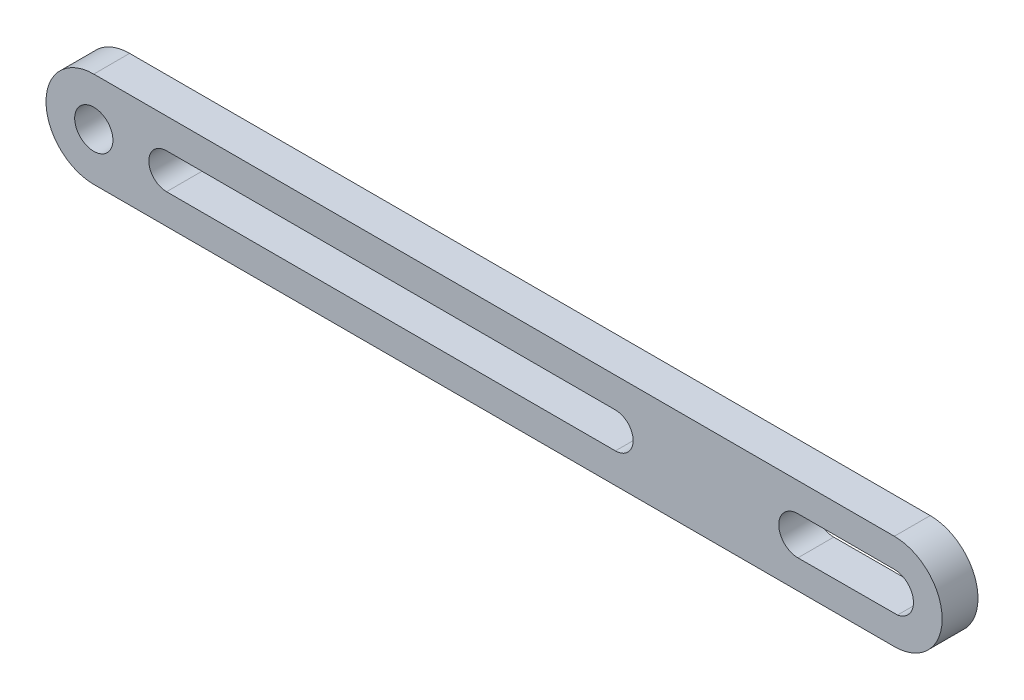
ISO-10303-21;
HEADER;
FILE_DESCRIPTION(('STEP AP214'),'2;1');
FILE_NAME('part.step','',(''),(''),'','','');
FILE_SCHEMA(('AUTOMOTIVE_DESIGN { 1 0 10303 214 1 1 1 1 }'));
ENDSEC;
DATA;
#1=APPLICATION_CONTEXT('core data for automotive mechanical design processes');
#2=APPLICATION_PROTOCOL_DEFINITION('international standard','automotive_design',2000,#1);
#3=PRODUCT_CONTEXT('',#1,'mechanical');
#4=PRODUCT('Part','Part','',(#3));
#5=PRODUCT_RELATED_PRODUCT_CATEGORY('part','',(#4));
#6=PRODUCT_DEFINITION_FORMATION('','',#4);
#7=PRODUCT_DEFINITION_CONTEXT('part definition',#1,'design');
#8=PRODUCT_DEFINITION('design','',#6,#7);
#9=PRODUCT_DEFINITION_SHAPE('','',#8);
#10=(LENGTH_UNIT() NAMED_UNIT(*) SI_UNIT(.MILLI.,.METRE.));
#11=(NAMED_UNIT(*) PLANE_ANGLE_UNIT() SI_UNIT($,.RADIAN.));
#12=(NAMED_UNIT(*) SI_UNIT($,.STERADIAN.) SOLID_ANGLE_UNIT());
#13=UNCERTAINTY_MEASURE_WITH_UNIT(LENGTH_MEASURE(1.E-05),#10,'distance_accuracy_value','');
#14=(GEOMETRIC_REPRESENTATION_CONTEXT(3) GLOBAL_UNCERTAINTY_ASSIGNED_CONTEXT((#13)) GLOBAL_UNIT_ASSIGNED_CONTEXT((#10,
#11,#12)) REPRESENTATION_CONTEXT('',''));
#15=CARTESIAN_POINT('',(0.,0.,0.));
#16=DIRECTION('',(0.,0.,1.));
#17=DIRECTION('',(1.,0.,0.));
#18=AXIS2_PLACEMENT_3D('',#15,#16,#17);
#19=CARTESIAN_POINT('',(-53.8502428277937,0.,3.));
#20=DIRECTION('',(0.,0.,-1.));
#21=DIRECTION('',(-1.,0.,0.));
#22=AXIS2_PLACEMENT_3D('',#19,#20,#21);
#23=CYLINDRICAL_SURFACE('',#22,4.);
#24=CARTESIAN_POINT('',(-53.8502428277937,0.,0.));
#25=DIRECTION('',(0.,0.,1.));
#26=DIRECTION('',(1.,0.,0.));
#27=AXIS2_PLACEMENT_3D('',#24,#25,#26);
#28=CIRCLE('',#27,4.);
#29=CARTESIAN_POINT('',(-53.8502428277937,4.,0.));
#30=VERTEX_POINT('',#29);
#31=CARTESIAN_POINT('',(-53.8502428277937,-4.,0.));
#32=VERTEX_POINT('',#31);
#33=EDGE_CURVE('E208',#30,#32,#28,.T.);
#34=ORIENTED_EDGE('',*,*,#33,.T.);
#35=DIRECTION('',(0.,0.,-1.));
#36=VECTOR('',#35,1.);
#37=CARTESIAN_POINT('',(-53.8502428277937,-4.,3.));
#38=LINE('',#37,#36);
#39=CARTESIAN_POINT('',(-53.8502428277937,-4.,3.));
#40=VERTEX_POINT('',#39);
#41=EDGE_CURVE('E11',#40,#32,#38,.T.);
#42=ORIENTED_EDGE('',*,*,#41,.F.);
#43=CARTESIAN_POINT('',(-53.8502428277937,0.,3.));
#44=DIRECTION('',(0.,0.,1.));
#45=DIRECTION('',(1.,0.,0.));
#46=AXIS2_PLACEMENT_3D('',#43,#44,#45);
#47=CIRCLE('',#46,4.);
#48=CARTESIAN_POINT('',(-53.8502428277937,4.,3.));
#49=VERTEX_POINT('',#48);
#50=EDGE_CURVE('E195',#49,#40,#47,.T.);
#51=ORIENTED_EDGE('',*,*,#50,.F.);
#52=DIRECTION('',(0.,0.,-1.));
#53=VECTOR('',#52,1.);
#54=CARTESIAN_POINT('',(-53.8502428277937,4.,3.));
#55=LINE('',#54,#53);
#56=EDGE_CURVE('E207',#49,#30,#55,.T.);
#57=ORIENTED_EDGE('',*,*,#56,.T.);
#58=EDGE_LOOP('',(#34,#42,#51,#57));
#59=FACE_BOUND('',#58,.T.);
#60=ADVANCED_FACE('F35',(#59),#23,.T.);
#61=CARTESIAN_POINT('',(-53.8502428277937,-4.,3.));
#62=DIRECTION('',(0.,1.,0.));
#63=DIRECTION('',(-1.,0.,0.));
#64=AXIS2_PLACEMENT_3D('',#61,#62,#63);
#65=PLANE('',#64);
#66=DIRECTION('',(1.,0.,0.));
#67=VECTOR('',#66,1.);
#68=CARTESIAN_POINT('',(-53.8502428277937,-4.,0.));
#69=LINE('',#68,#67);
#70=CARTESIAN_POINT('',(13.1497571722063,-4.,0.));
#71=VERTEX_POINT('',#70);
#72=EDGE_CURVE('E211',#32,#71,#69,.T.);
#73=ORIENTED_EDGE('',*,*,#72,.T.);
#74=DIRECTION('',(0.,0.,-1.));
#75=VECTOR('',#74,1.);
#76=CARTESIAN_POINT('',(13.1497571722063,-4.,3.));
#77=LINE('',#76,#75);
#78=CARTESIAN_POINT('',(13.1497571722063,-4.,3.));
#79=VERTEX_POINT('',#78);
#80=EDGE_CURVE('E42',#79,#71,#77,.T.);
#81=ORIENTED_EDGE('',*,*,#80,.F.);
#82=DIRECTION('',(1.,0.,0.));
#83=VECTOR('',#82,1.);
#84=CARTESIAN_POINT('',(-53.8502428277937,-4.,3.));
#85=LINE('',#84,#83);
#86=EDGE_CURVE('E198',#40,#79,#85,.T.);
#87=ORIENTED_EDGE('',*,*,#86,.F.);
#88=ORIENTED_EDGE('',*,*,#41,.T.);
#89=EDGE_LOOP('',(#73,#81,#87,#88));
#90=FACE_BOUND('',#89,.T.);
#91=ADVANCED_FACE('F228',(#90),#65,.F.);
#92=CARTESIAN_POINT('',(13.1497571722063,0.,3.));
#93=DIRECTION('',(0.,0.,-1.));
#94=DIRECTION('',(-1.,0.,0.));
#95=AXIS2_PLACEMENT_3D('',#92,#93,#94);
#96=CYLINDRICAL_SURFACE('',#95,4.);
#97=CARTESIAN_POINT('',(13.1497571722063,0.,0.));
#98=DIRECTION('',(0.,0.,-1.));
#99=DIRECTION('',(-1.,0.,0.));
#100=AXIS2_PLACEMENT_3D('',#97,#98,#99);
#101=CIRCLE('',#100,4.);
#102=CARTESIAN_POINT('',(13.1497571722063,4.,0.));
#103=VERTEX_POINT('',#102);
#104=EDGE_CURVE('E215',#103,#71,#101,.T.);
#105=ORIENTED_EDGE('',*,*,#104,.F.);
#106=DIRECTION('',(0.,0.,-1.));
#107=VECTOR('',#106,1.);
#108=CARTESIAN_POINT('',(13.1497571722063,4.,3.));
#109=LINE('',#108,#107);
#110=CARTESIAN_POINT('',(13.1497571722063,4.,3.));
#111=VERTEX_POINT('',#110);
#112=EDGE_CURVE('E221',#111,#103,#109,.T.);
#113=ORIENTED_EDGE('',*,*,#112,.F.);
#114=CARTESIAN_POINT('',(13.1497571722063,0.,3.));
#115=DIRECTION('',(0.,0.,-1.));
#116=DIRECTION('',(-1.,0.,0.));
#117=AXIS2_PLACEMENT_3D('',#114,#115,#116);
#118=CIRCLE('',#117,4.);
#119=EDGE_CURVE('E201',#111,#79,#118,.T.);
#120=ORIENTED_EDGE('',*,*,#119,.T.);
#121=ORIENTED_EDGE('',*,*,#80,.T.);
#122=EDGE_LOOP('',(#105,#113,#120,#121));
#123=FACE_BOUND('',#122,.T.);
#124=ADVANCED_FACE('F225',(#123),#96,.T.);
#125=CARTESIAN_POINT('',(-53.8502428277937,4.,3.));
#126=DIRECTION('',(0.,1.,0.));
#127=DIRECTION('',(-1.,0.,0.));
#128=AXIS2_PLACEMENT_3D('',#125,#126,#127);
#129=PLANE('',#128);
#130=DIRECTION('',(1.,0.,0.));
#131=VECTOR('',#130,1.);
#132=CARTESIAN_POINT('',(-53.8502428277937,4.,0.));
#133=LINE('',#132,#131);
#134=EDGE_CURVE('E199',#30,#103,#133,.T.);
#135=ORIENTED_EDGE('',*,*,#134,.F.);
#136=ORIENTED_EDGE('',*,*,#56,.F.);
#137=DIRECTION('',(1.,0.,0.));
#138=VECTOR('',#137,1.);
#139=CARTESIAN_POINT('',(-53.8502428277937,4.,3.));
#140=LINE('',#139,#138);
#141=EDGE_CURVE('E204',#49,#111,#140,.T.);
#142=ORIENTED_EDGE('',*,*,#141,.T.);
#143=ORIENTED_EDGE('',*,*,#112,.T.);
#144=EDGE_LOOP('',(#135,#136,#142,#143));
#145=FACE_BOUND('',#144,.T.);
#146=ADVANCED_FACE('F234',(#145),#129,.T.);
#147=CARTESIAN_POINT('',(-53.8502428277937,0.,3.));
#148=DIRECTION('',(0.,0.,1.));
#149=DIRECTION('',(1.,0.,0.));
#150=AXIS2_PLACEMENT_3D('',#147,#148,#149);
#151=PLANE('',#150);
#152=CARTESIAN_POINT('',(-53.8502428277937,0.,3.));
#153=DIRECTION('',(0.,0.,1.));
#154=DIRECTION('',(1.,0.,0.));
#155=AXIS2_PLACEMENT_3D('',#152,#153,#154);
#156=CIRCLE('',#155,1.6);
#157=CARTESIAN_POINT('',(-52.2502428277937,0.,3.));
#158=VERTEX_POINT('',#157);
#159=EDGE_CURVE('E150',#158,#158,#156,.T.);
#160=ORIENTED_EDGE('',*,*,#159,.F.);
#161=EDGE_LOOP('',(#160));
#162=FACE_BOUND('',#161,.T.);
#163=CARTESIAN_POINT('',(-47.7619263249509,0.,3.));
#164=DIRECTION('',(0.,0.,1.));
#165=DIRECTION('',(1.,0.,0.));
#166=AXIS2_PLACEMENT_3D('',#163,#164,#165);
#167=CIRCLE('',#166,1.48347158184053);
#168=CARTESIAN_POINT('',(-47.7619263249509,1.48347158184053,3.));
#169=VERTEX_POINT('',#168);
#170=CARTESIAN_POINT('',(-47.7619263249509,-1.48347158184053,3.));
#171=VERTEX_POINT('',#170);
#172=EDGE_CURVE('E49',#169,#171,#167,.T.);
#173=ORIENTED_EDGE('',*,*,#172,.F.);
#174=DIRECTION('',(-1.,0.,0.));
#175=VECTOR('',#174,1.);
#176=CARTESIAN_POINT('',(-47.7619263249509,1.48347158184053,3.));
#177=LINE('',#176,#175);
#178=CARTESIAN_POINT('',(-10.1945582776389,1.48347158184053,3.));
#179=VERTEX_POINT('',#178);
#180=EDGE_CURVE('E144',#179,#169,#177,.T.);
#181=ORIENTED_EDGE('',*,*,#180,.F.);
#182=CARTESIAN_POINT('',(-10.1945582776389,0.,3.));
#183=DIRECTION('',(0.,0.,1.));
#184=DIRECTION('',(-1.,0.,0.));
#185=AXIS2_PLACEMENT_3D('',#182,#183,#184);
#186=CIRCLE('',#185,1.48347158184053);
#187=CARTESIAN_POINT('',(-10.1945582776389,-1.48347158184053,3.));
#188=VERTEX_POINT('',#187);
#189=EDGE_CURVE('E147',#188,#179,#186,.T.);
#190=ORIENTED_EDGE('',*,*,#189,.F.);
#191=DIRECTION('',(1.,0.,0.));
#192=VECTOR('',#191,1.);
#193=CARTESIAN_POINT('',(-47.7619263249509,-1.48347158184053,3.));
#194=LINE('',#193,#192);
#195=EDGE_CURVE('E156',#171,#188,#194,.T.);
#196=ORIENTED_EDGE('',*,*,#195,.F.);
#197=EDGE_LOOP('',(#173,#181,#190,#196));
#198=FACE_BOUND('',#197,.T.);
#199=CARTESIAN_POINT('',(5.076512496842,0.,3.));
#200=DIRECTION('',(0.,0.,1.));
#201=DIRECTION('',(1.,0.,0.));
#202=AXIS2_PLACEMENT_3D('',#199,#200,#201);
#203=CIRCLE('',#202,1.6);
#204=CARTESIAN_POINT('',(5.076512496842,1.6,3.));
#205=VERTEX_POINT('',#204);
#206=CARTESIAN_POINT('',(5.076512496842,-1.6,3.));
#207=VERTEX_POINT('',#206);
#208=EDGE_CURVE('E57',#205,#207,#203,.T.);
#209=ORIENTED_EDGE('',*,*,#208,.F.);
#210=DIRECTION('',(-1.,0.,0.));
#211=VECTOR('',#210,1.);
#212=CARTESIAN_POINT('',(5.076512496842,1.6,3.));
#213=LINE('',#212,#211);
#214=CARTESIAN_POINT('',(13.1497571722063,1.60000000000001,3.));
#215=VERTEX_POINT('',#214);
#216=EDGE_CURVE('E170',#215,#205,#213,.T.);
#217=ORIENTED_EDGE('',*,*,#216,.F.);
#218=CARTESIAN_POINT('',(13.1497571722063,0.,3.));
#219=DIRECTION('',(0.,0.,1.));
#220=DIRECTION('',(-1.,0.,0.));
#221=AXIS2_PLACEMENT_3D('',#218,#219,#220);
#222=CIRCLE('',#221,1.6);
#223=CARTESIAN_POINT('',(13.4123699058144,-1.57830116015507,3.));
#224=VERTEX_POINT('',#223);
#225=EDGE_CURVE('E184',#224,#215,#222,.T.);
#226=ORIENTED_EDGE('',*,*,#225,.F.);
#227=DIRECTION('',(0.999996612024416,0.00260306352006838,0.));
#228=VECTOR('',#227,1.);
#229=CARTESIAN_POINT('',(5.076512496842,-1.6,3.));
#230=LINE('',#229,#228);
#231=EDGE_CURVE('E181',#207,#224,#230,.T.);
#232=ORIENTED_EDGE('',*,*,#231,.F.);
#233=EDGE_LOOP('',(#209,#217,#226,#232));
#234=FACE_BOUND('',#233,.T.);
#235=ORIENTED_EDGE('',*,*,#50,.T.);
#236=ORIENTED_EDGE('',*,*,#86,.T.);
#237=ORIENTED_EDGE('',*,*,#119,.F.);
#238=ORIENTED_EDGE('',*,*,#141,.F.);
#239=EDGE_LOOP('',(#235,#236,#237,#238));
#240=FACE_BOUND('',#239,.T.);
#241=ADVANCED_FACE('F238',(#162,#198,#234,#240),#151,.T.);
#242=CARTESIAN_POINT('',(-53.8502428277937,0.,0.));
#243=DIRECTION('',(0.,0.,1.));
#244=DIRECTION('',(1.,0.,0.));
#245=AXIS2_PLACEMENT_3D('',#242,#243,#244);
#246=PLANE('',#245);
#247=CARTESIAN_POINT('',(-53.8502428277937,0.,0.));
#248=DIRECTION('',(0.,0.,1.));
#249=DIRECTION('',(1.,0.,0.));
#250=AXIS2_PLACEMENT_3D('',#247,#248,#249);
#251=CIRCLE('',#250,1.6);
#252=CARTESIAN_POINT('',(-52.2502428277937,0.,0.));
#253=VERTEX_POINT('',#252);
#254=EDGE_CURVE('E212',#253,#253,#251,.T.);
#255=ORIENTED_EDGE('',*,*,#254,.T.);
#256=EDGE_LOOP('',(#255));
#257=FACE_BOUND('',#256,.T.);
#258=DIRECTION('',(-1.,0.,0.));
#259=VECTOR('',#258,1.);
#260=CARTESIAN_POINT('',(-47.7619263249509,1.48347158184053,0.));
#261=LINE('',#260,#259);
#262=CARTESIAN_POINT('',(-10.1945582776389,1.48347158184053,0.));
#263=VERTEX_POINT('',#262);
#264=CARTESIAN_POINT('',(-47.7619263249509,1.48347158184053,0.));
#265=VERTEX_POINT('',#264);
#266=EDGE_CURVE('E131',#263,#265,#261,.T.);
#267=ORIENTED_EDGE('',*,*,#266,.T.);
#268=CARTESIAN_POINT('',(-47.7619263249509,0.,0.));
#269=DIRECTION('',(0.,0.,1.));
#270=DIRECTION('',(1.,0.,0.));
#271=AXIS2_PLACEMENT_3D('',#268,#269,#270);
#272=CIRCLE('',#271,1.48347158184053);
#273=CARTESIAN_POINT('',(-47.7619263249509,-1.48347158184053,0.));
#274=VERTEX_POINT('',#273);
#275=EDGE_CURVE('E125',#265,#274,#272,.T.);
#276=ORIENTED_EDGE('',*,*,#275,.T.);
#277=DIRECTION('',(1.,0.,0.));
#278=VECTOR('',#277,1.);
#279=CARTESIAN_POINT('',(-47.7619263249509,-1.48347158184053,0.));
#280=LINE('',#279,#278);
#281=CARTESIAN_POINT('',(-10.1945582776389,-1.48347158184053,0.));
#282=VERTEX_POINT('',#281);
#283=EDGE_CURVE('E135',#274,#282,#280,.T.);
#284=ORIENTED_EDGE('',*,*,#283,.T.);
#285=CARTESIAN_POINT('',(-10.1945582776389,0.,0.));
#286=DIRECTION('',(0.,0.,1.));
#287=DIRECTION('',(-1.,0.,0.));
#288=AXIS2_PLACEMENT_3D('',#285,#286,#287);
#289=CIRCLE('',#288,1.48347158184053);
#290=EDGE_CURVE('E139',#282,#263,#289,.T.);
#291=ORIENTED_EDGE('',*,*,#290,.T.);
#292=EDGE_LOOP('',(#267,#276,#284,#291));
#293=FACE_BOUND('',#292,.T.);
#294=DIRECTION('',(-1.,0.,0.));
#295=VECTOR('',#294,1.);
#296=CARTESIAN_POINT('',(5.076512496842,1.6,0.));
#297=LINE('',#296,#295);
#298=CARTESIAN_POINT('',(13.1497571722063,1.60000000000001,0.));
#299=VERTEX_POINT('',#298);
#300=CARTESIAN_POINT('',(5.076512496842,1.6,0.));
#301=VERTEX_POINT('',#300);
#302=EDGE_CURVE('E176',#299,#301,#297,.T.);
#303=ORIENTED_EDGE('',*,*,#302,.T.);
#304=CARTESIAN_POINT('',(5.076512496842,0.,0.));
#305=DIRECTION('',(0.,0.,1.));
#306=DIRECTION('',(1.,0.,0.));
#307=AXIS2_PLACEMENT_3D('',#304,#305,#306);
#308=CIRCLE('',#307,1.6);
#309=CARTESIAN_POINT('',(5.076512496842,-1.6,0.));
#310=VERTEX_POINT('',#309);
#311=EDGE_CURVE('E166',#301,#310,#308,.T.);
#312=ORIENTED_EDGE('',*,*,#311,.T.);
#313=DIRECTION('',(0.999996612024416,0.00260306352006838,0.));
#314=VECTOR('',#313,1.);
#315=CARTESIAN_POINT('',(5.076512496842,-1.6,0.));
#316=LINE('',#315,#314);
#317=CARTESIAN_POINT('',(13.4123699058144,-1.57830116015507,0.));
#318=VERTEX_POINT('',#317);
#319=EDGE_CURVE('E169',#310,#318,#316,.T.);
#320=ORIENTED_EDGE('',*,*,#319,.T.);
#321=CARTESIAN_POINT('',(13.1497571722063,0.,0.));
#322=DIRECTION('',(0.,0.,1.));
#323=DIRECTION('',(-1.,0.,0.));
#324=AXIS2_PLACEMENT_3D('',#321,#322,#323);
#325=CIRCLE('',#324,1.6);
#326=EDGE_CURVE('E173',#318,#299,#325,.T.);
#327=ORIENTED_EDGE('',*,*,#326,.T.);
#328=EDGE_LOOP('',(#303,#312,#320,#327));
#329=FACE_BOUND('',#328,.T.);
#330=ORIENTED_EDGE('',*,*,#33,.F.);
#331=ORIENTED_EDGE('',*,*,#134,.T.);
#332=ORIENTED_EDGE('',*,*,#104,.T.);
#333=ORIENTED_EDGE('',*,*,#72,.F.);
#334=EDGE_LOOP('',(#330,#331,#332,#333));
#335=FACE_BOUND('',#334,.T.);
#336=ADVANCED_FACE('F141',(#257,#293,#329,#335),#246,.F.);
#337=CARTESIAN_POINT('',(5.076512496842,0.,0.));
#338=DIRECTION('',(0.,0.,1.));
#339=DIRECTION('',(1.,0.,0.));
#340=AXIS2_PLACEMENT_3D('',#337,#338,#339);
#341=CYLINDRICAL_SURFACE('',#340,1.6);
#342=ORIENTED_EDGE('',*,*,#208,.T.);
#343=DIRECTION('',(0.,0.,1.));
#344=VECTOR('',#343,1.);
#345=CARTESIAN_POINT('',(5.076512496842,-1.6,0.));
#346=LINE('',#345,#344);
#347=EDGE_CURVE('E179',#310,#207,#346,.T.);
#348=ORIENTED_EDGE('',*,*,#347,.F.);
#349=ORIENTED_EDGE('',*,*,#311,.F.);
#350=DIRECTION('',(0.,0.,1.));
#351=VECTOR('',#350,1.);
#352=CARTESIAN_POINT('',(5.076512496842,1.6,0.));
#353=LINE('',#352,#351);
#354=EDGE_CURVE('E157',#301,#205,#353,.T.);
#355=ORIENTED_EDGE('',*,*,#354,.T.);
#356=EDGE_LOOP('',(#342,#348,#349,#355));
#357=FACE_BOUND('',#356,.T.);
#358=ADVANCED_FACE('F253',(#357),#341,.F.);
#359=CARTESIAN_POINT('',(5.076512496842,1.6,0.));
#360=DIRECTION('',(0.,1.,0.));
#361=DIRECTION('',(-1.,0.,0.));
#362=AXIS2_PLACEMENT_3D('',#359,#360,#361);
#363=PLANE('',#362);
#364=ORIENTED_EDGE('',*,*,#216,.T.);
#365=ORIENTED_EDGE('',*,*,#354,.F.);
#366=ORIENTED_EDGE('',*,*,#302,.F.);
#367=DIRECTION('',(0.,0.,1.));
#368=VECTOR('',#367,1.);
#369=CARTESIAN_POINT('',(13.1497571722063,1.60000000000001,0.));
#370=LINE('',#369,#368);
#371=EDGE_CURVE('E190',#299,#215,#370,.T.);
#372=ORIENTED_EDGE('',*,*,#371,.T.);
#373=EDGE_LOOP('',(#364,#365,#366,#372));
#374=FACE_BOUND('',#373,.T.);
#375=ADVANCED_FACE('F260',(#374),#363,.F.);
#376=CARTESIAN_POINT('',(13.1497571722063,0.,0.));
#377=DIRECTION('',(0.,0.,1.));
#378=DIRECTION('',(1.,0.,0.));
#379=AXIS2_PLACEMENT_3D('',#376,#377,#378);
#380=CYLINDRICAL_SURFACE('',#379,1.6);
#381=ORIENTED_EDGE('',*,*,#225,.T.);
#382=ORIENTED_EDGE('',*,*,#371,.F.);
#383=ORIENTED_EDGE('',*,*,#326,.F.);
#384=DIRECTION('',(0.,0.,1.));
#385=VECTOR('',#384,1.);
#386=CARTESIAN_POINT('',(13.4123699058144,-1.57830116015507,0.));
#387=LINE('',#386,#385);
#388=EDGE_CURVE('E192',#318,#224,#387,.T.);
#389=ORIENTED_EDGE('',*,*,#388,.T.);
#390=EDGE_LOOP('',(#381,#382,#383,#389));
#391=FACE_BOUND('',#390,.T.);
#392=ADVANCED_FACE('F264',(#391),#380,.F.);
#393=CARTESIAN_POINT('',(5.076512496842,-1.6,0.));
#394=DIRECTION('',(0.00260306352006838,-0.999996612024416,0.));
#395=DIRECTION('',(0.999996612024416,0.00260306352006838,0.));
#396=AXIS2_PLACEMENT_3D('',#393,#394,#395);
#397=PLANE('',#396);
#398=ORIENTED_EDGE('',*,*,#231,.T.);
#399=ORIENTED_EDGE('',*,*,#388,.F.);
#400=ORIENTED_EDGE('',*,*,#319,.F.);
#401=ORIENTED_EDGE('',*,*,#347,.T.);
#402=EDGE_LOOP('',(#398,#399,#400,#401));
#403=FACE_BOUND('',#402,.T.);
#404=ADVANCED_FACE('F261',(#403),#397,.F.);
#405=CARTESIAN_POINT('',(-47.7619263249509,0.,0.));
#406=DIRECTION('',(0.,0.,1.));
#407=DIRECTION('',(1.,0.,0.));
#408=AXIS2_PLACEMENT_3D('',#405,#406,#407);
#409=CYLINDRICAL_SURFACE('',#408,1.48347158184053);
#410=ORIENTED_EDGE('',*,*,#172,.T.);
#411=DIRECTION('',(0.,0.,1.));
#412=VECTOR('',#411,1.);
#413=CARTESIAN_POINT('',(-47.7619263249509,-1.48347158184053,0.));
#414=LINE('',#413,#412);
#415=EDGE_CURVE('E121',#274,#171,#414,.T.);
#416=ORIENTED_EDGE('',*,*,#415,.F.);
#417=ORIENTED_EDGE('',*,*,#275,.F.);
#418=DIRECTION('',(0.,0.,1.));
#419=VECTOR('',#418,1.);
#420=CARTESIAN_POINT('',(-47.7619263249509,1.48347158184053,0.));
#421=LINE('',#420,#419);
#422=EDGE_CURVE('E161',#265,#169,#421,.T.);
#423=ORIENTED_EDGE('',*,*,#422,.T.);
#424=EDGE_LOOP('',(#410,#416,#417,#423));
#425=FACE_BOUND('',#424,.T.);
#426=ADVANCED_FACE('F123',(#425),#409,.F.);
#427=CARTESIAN_POINT('',(-47.7619263249509,1.48347158184053,0.));
#428=DIRECTION('',(0.,1.,0.));
#429=DIRECTION('',(0.,0.,1.));
#430=AXIS2_PLACEMENT_3D('',#427,#428,#429);
#431=PLANE('',#430);
#432=ORIENTED_EDGE('',*,*,#180,.T.);
#433=ORIENTED_EDGE('',*,*,#422,.F.);
#434=ORIENTED_EDGE('',*,*,#266,.F.);
#435=DIRECTION('',(0.,0.,1.));
#436=VECTOR('',#435,1.);
#437=CARTESIAN_POINT('',(-10.1945582776389,1.48347158184053,0.));
#438=LINE('',#437,#436);
#439=EDGE_CURVE('E163',#263,#179,#438,.T.);
#440=ORIENTED_EDGE('',*,*,#439,.T.);
#441=EDGE_LOOP('',(#432,#433,#434,#440));
#442=FACE_BOUND('',#441,.T.);
#443=ADVANCED_FACE('F274',(#442),#431,.F.);
#444=CARTESIAN_POINT('',(-10.1945582776389,0.,0.));
#445=DIRECTION('',(0.,0.,1.));
#446=DIRECTION('',(1.,0.,0.));
#447=AXIS2_PLACEMENT_3D('',#444,#445,#446);
#448=CYLINDRICAL_SURFACE('',#447,1.48347158184053);
#449=ORIENTED_EDGE('',*,*,#189,.T.);
#450=ORIENTED_EDGE('',*,*,#439,.F.);
#451=ORIENTED_EDGE('',*,*,#290,.F.);
#452=DIRECTION('',(0.,0.,1.));
#453=VECTOR('',#452,1.);
#454=CARTESIAN_POINT('',(-10.1945582776389,-1.48347158184053,0.));
#455=LINE('',#454,#453);
#456=EDGE_CURVE('E130',#282,#188,#455,.T.);
#457=ORIENTED_EDGE('',*,*,#456,.T.);
#458=EDGE_LOOP('',(#449,#450,#451,#457));
#459=FACE_BOUND('',#458,.T.);
#460=ADVANCED_FACE('F278',(#459),#448,.F.);
#461=CARTESIAN_POINT('',(-47.7619263249509,-1.48347158184053,0.));
#462=DIRECTION('',(0.,-1.,0.));
#463=DIRECTION('',(0.,0.,-1.));
#464=AXIS2_PLACEMENT_3D('',#461,#462,#463);
#465=PLANE('',#464);
#466=ORIENTED_EDGE('',*,*,#195,.T.);
#467=ORIENTED_EDGE('',*,*,#456,.F.);
#468=ORIENTED_EDGE('',*,*,#283,.F.);
#469=ORIENTED_EDGE('',*,*,#415,.T.);
#470=EDGE_LOOP('',(#466,#467,#468,#469));
#471=FACE_BOUND('',#470,.T.);
#472=ADVANCED_FACE('F136',(#471),#465,.F.);
#473=CARTESIAN_POINT('',(-53.8502428277937,0.,0.));
#474=DIRECTION('',(0.,0.,1.));
#475=DIRECTION('',(1.,0.,0.));
#476=AXIS2_PLACEMENT_3D('',#473,#474,#475);
#477=CYLINDRICAL_SURFACE('',#476,1.6);
#478=ORIENTED_EDGE('',*,*,#254,.F.);
#479=EDGE_LOOP('',(#478));
#480=FACE_BOUND('',#479,.T.);
#481=ORIENTED_EDGE('',*,*,#159,.T.);
#482=EDGE_LOOP('',(#481));
#483=FACE_BOUND('',#482,.T.);
#484=ADVANCED_FACE('F277',(#480,#483),#477,.F.);
#485=CLOSED_SHELL('',(#60,#91,#124,#146,#241,#336,#358,#375,#392,#404,#426,#443,#460,#472,#484));
#486=MANIFOLD_SOLID_BREP('B2',#485);
#487=ADVANCED_BREP_SHAPE_REPRESENTATION('',(#18,#486),#14);
#488=SHAPE_DEFINITION_REPRESENTATION(#9,#487);
ENDSEC;
END-ISO-10303-21;
